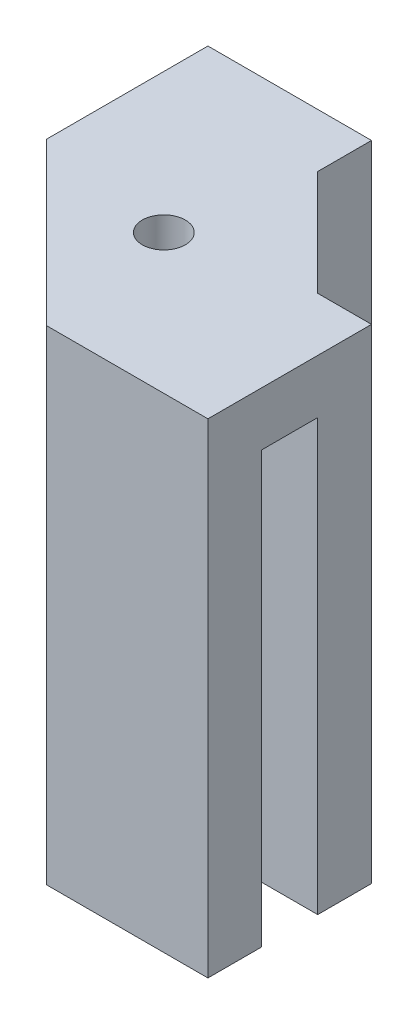
ISO-10303-21;
HEADER;
FILE_DESCRIPTION(('STEP AP214'),'2;1');
FILE_NAME('part.step','',(''),(''),'','','');
FILE_SCHEMA(('AUTOMOTIVE_DESIGN { 1 0 10303 214 1 1 1 1 }'));
ENDSEC;
DATA;
#1=APPLICATION_CONTEXT('core data for automotive mechanical design processes');
#2=APPLICATION_PROTOCOL_DEFINITION('international standard','automotive_design',2000,#1);
#3=PRODUCT_CONTEXT('',#1,'mechanical');
#4=PRODUCT('Part','Part','',(#3));
#5=PRODUCT_RELATED_PRODUCT_CATEGORY('part','',(#4));
#6=PRODUCT_DEFINITION_FORMATION('','',#4);
#7=PRODUCT_DEFINITION_CONTEXT('part definition',#1,'design');
#8=PRODUCT_DEFINITION('design','',#6,#7);
#9=PRODUCT_DEFINITION_SHAPE('','',#8);
#10=(LENGTH_UNIT() NAMED_UNIT(*) SI_UNIT(.MILLI.,.METRE.));
#11=(NAMED_UNIT(*) PLANE_ANGLE_UNIT() SI_UNIT($,.RADIAN.));
#12=(NAMED_UNIT(*) SI_UNIT($,.STERADIAN.) SOLID_ANGLE_UNIT());
#13=UNCERTAINTY_MEASURE_WITH_UNIT(LENGTH_MEASURE(1.E-05),#10,'distance_accuracy_value','');
#14=(GEOMETRIC_REPRESENTATION_CONTEXT(3) GLOBAL_UNCERTAINTY_ASSIGNED_CONTEXT((#13)) GLOBAL_UNIT_ASSIGNED_CONTEXT((#10,
#11,#12)) REPRESENTATION_CONTEXT('',''));
#15=CARTESIAN_POINT('',(0.,0.,0.));
#16=DIRECTION('',(0.,0.,1.));
#17=DIRECTION('',(1.,0.,0.));
#18=AXIS2_PLACEMENT_3D('',#15,#16,#17);
#19=CARTESIAN_POINT('',(9.652,50.8,-22.098));
#20=DIRECTION('',(-1.,0.,0.));
#21=DIRECTION('',(0.,0.,1.));
#22=AXIS2_PLACEMENT_3D('',#19,#20,#21);
#23=PLANE('',#22);
#24=DIRECTION('',(0.,0.,-1.));
#25=VECTOR('',#24,1.);
#26=CARTESIAN_POINT('',(9.652,0.,-22.098));
#27=LINE('',#26,#25);
#28=CARTESIAN_POINT('',(9.652,0.,-22.098));
#29=VERTEX_POINT('',#28);
#30=CARTESIAN_POINT('',(9.652,0.,-28.4479999999999));
#31=VERTEX_POINT('',#30);
#32=EDGE_CURVE('E178',#29,#31,#27,.T.);
#33=ORIENTED_EDGE('',*,*,#32,.T.);
#34=DIRECTION('',(0.,-1.,0.));
#35=VECTOR('',#34,1.);
#36=CARTESIAN_POINT('',(9.652,50.8,-28.4479999999999));
#37=LINE('',#36,#35);
#38=CARTESIAN_POINT('',(9.652,57.15,-28.4479999999999));
#39=VERTEX_POINT('',#38);
#40=EDGE_CURVE('E11',#39,#31,#37,.T.);
#41=ORIENTED_EDGE('',*,*,#40,.F.);
#42=DIRECTION('',(0.,0.,-1.));
#43=VECTOR('',#42,1.);
#44=CARTESIAN_POINT('',(9.652,57.15,-22.098));
#45=LINE('',#44,#43);
#46=CARTESIAN_POINT('',(9.652,57.15,-22.098));
#47=VERTEX_POINT('',#46);
#48=EDGE_CURVE('E169',#47,#39,#45,.T.);
#49=ORIENTED_EDGE('',*,*,#48,.F.);
#50=DIRECTION('',(0.,-1.,0.));
#51=VECTOR('',#50,1.);
#52=CARTESIAN_POINT('',(9.652,50.8,-22.098));
#53=LINE('',#52,#51);
#54=EDGE_CURVE('E190',#47,#29,#53,.T.);
#55=ORIENTED_EDGE('',*,*,#54,.T.);
#56=EDGE_LOOP('',(#33,#41,#49,#55));
#57=FACE_BOUND('',#56,.T.);
#58=ADVANCED_FACE('F39',(#57),#23,.F.);
#59=CARTESIAN_POINT('',(3.302,50.8,-28.4479999999999));
#60=DIRECTION('',(1.,0.,0.));
#61=DIRECTION('',(0.,0.,-1.));
#62=AXIS2_PLACEMENT_3D('',#59,#60,#61);
#63=PLANE('',#62);
#64=DIRECTION('',(0.,0.,1.));
#65=VECTOR('',#64,1.);
#66=CARTESIAN_POINT('',(3.302,0.,-28.4479999999999));
#67=LINE('',#66,#65);
#68=CARTESIAN_POINT('',(3.302,0.,-28.4479999999999));
#69=VERTEX_POINT('',#68);
#70=CARTESIAN_POINT('',(3.302,0.,-15.748));
#71=VERTEX_POINT('',#70);
#72=EDGE_CURVE('E195',#69,#71,#67,.T.);
#73=ORIENTED_EDGE('',*,*,#72,.T.);
#74=DIRECTION('',(0.,-1.,0.));
#75=VECTOR('',#74,1.);
#76=CARTESIAN_POINT('',(3.302,50.8,-15.748));
#77=LINE('',#76,#75);
#78=CARTESIAN_POINT('',(3.302,50.8,-15.748));
#79=VERTEX_POINT('',#78);
#80=EDGE_CURVE('E245',#79,#71,#77,.T.);
#81=ORIENTED_EDGE('',*,*,#80,.F.);
#82=DIRECTION('',(0.,0.,1.));
#83=VECTOR('',#82,1.);
#84=CARTESIAN_POINT('',(3.302,50.8,-28.4479999999999));
#85=LINE('',#84,#83);
#86=CARTESIAN_POINT('',(3.302,50.8,-28.4479999999999));
#87=VERTEX_POINT('',#86);
#88=EDGE_CURVE('E180',#87,#79,#85,.T.);
#89=ORIENTED_EDGE('',*,*,#88,.F.);
#90=DIRECTION('',(0.,-1.,0.));
#91=VECTOR('',#90,1.);
#92=CARTESIAN_POINT('',(3.302,50.8,-28.4479999999999));
#93=LINE('',#92,#91);
#94=EDGE_CURVE('E47',#87,#69,#93,.T.);
#95=ORIENTED_EDGE('',*,*,#94,.T.);
#96=EDGE_LOOP('',(#73,#81,#89,#95));
#97=FACE_BOUND('',#96,.T.);
#98=ADVANCED_FACE('F249',(#97),#63,.F.);
#99=CARTESIAN_POINT('',(3.302,50.8,-15.748));
#100=DIRECTION('',(0.,0.,1.));
#101=DIRECTION('',(1.,0.,0.));
#102=AXIS2_PLACEMENT_3D('',#99,#100,#101);
#103=PLANE('',#102);
#104=DIRECTION('',(-1.,0.,0.));
#105=VECTOR('',#104,1.);
#106=CARTESIAN_POINT('',(3.302,0.,-15.748));
#107=LINE('',#106,#105);
#108=CARTESIAN_POINT('',(-3.302,0.,-15.748));
#109=VERTEX_POINT('',#108);
#110=EDGE_CURVE('E197',#71,#109,#107,.T.);
#111=ORIENTED_EDGE('',*,*,#110,.T.);
#112=DIRECTION('',(0.,-1.,0.));
#113=VECTOR('',#112,1.);
#114=CARTESIAN_POINT('',(-3.302,50.8,-15.748));
#115=LINE('',#114,#113);
#116=CARTESIAN_POINT('',(-3.302,50.8,-15.748));
#117=VERTEX_POINT('',#116);
#118=EDGE_CURVE('E242',#117,#109,#115,.T.);
#119=ORIENTED_EDGE('',*,*,#118,.F.);
#120=DIRECTION('',(-1.,0.,0.));
#121=VECTOR('',#120,1.);
#122=CARTESIAN_POINT('',(3.302,50.8,-15.748));
#123=LINE('',#122,#121);
#124=EDGE_CURVE('E183',#79,#117,#123,.T.);
#125=ORIENTED_EDGE('',*,*,#124,.F.);
#126=ORIENTED_EDGE('',*,*,#80,.T.);
#127=EDGE_LOOP('',(#111,#119,#125,#126));
#128=FACE_BOUND('',#127,.T.);
#129=ADVANCED_FACE('F258',(#128),#103,.F.);
#130=CARTESIAN_POINT('',(-3.302,50.8,-28.4479999999999));
#131=DIRECTION('',(-1.,0.,0.));
#132=DIRECTION('',(0.,0.,1.));
#133=AXIS2_PLACEMENT_3D('',#130,#131,#132);
#134=PLANE('',#133);
#135=DIRECTION('',(0.,0.,-1.));
#136=VECTOR('',#135,1.);
#137=CARTESIAN_POINT('',(-3.302,0.,-28.4479999999999));
#138=LINE('',#137,#136);
#139=CARTESIAN_POINT('',(-3.302,0.,-28.4479999999999));
#140=VERTEX_POINT('',#139);
#141=EDGE_CURVE('E199',#109,#140,#138,.T.);
#142=ORIENTED_EDGE('',*,*,#141,.T.);
#143=DIRECTION('',(0.,-1.,0.));
#144=VECTOR('',#143,1.);
#145=CARTESIAN_POINT('',(-3.302,50.8,-28.4479999999999));
#146=LINE('',#145,#144);
#147=CARTESIAN_POINT('',(-3.302,50.8,-28.4479999999999));
#148=VERTEX_POINT('',#147);
#149=EDGE_CURVE('E239',#148,#140,#146,.T.);
#150=ORIENTED_EDGE('',*,*,#149,.F.);
#151=DIRECTION('',(0.,0.,-1.));
#152=VECTOR('',#151,1.);
#153=CARTESIAN_POINT('',(-3.302,50.8,-28.4479999999999));
#154=LINE('',#153,#152);
#155=EDGE_CURVE('E160',#117,#148,#154,.T.);
#156=ORIENTED_EDGE('',*,*,#155,.F.);
#157=ORIENTED_EDGE('',*,*,#118,.T.);
#158=EDGE_LOOP('',(#142,#150,#156,#157));
#159=FACE_BOUND('',#158,.T.);
#160=ADVANCED_FACE('F262',(#159),#134,.F.);
#161=CARTESIAN_POINT('',(-3.302,50.8,-28.4479999999999));
#162=DIRECTION('',(0.,0.,1.));
#163=DIRECTION('',(1.,0.,0.));
#164=AXIS2_PLACEMENT_3D('',#161,#162,#163);
#165=PLANE('',#164);
#166=DIRECTION('',(-1.,0.,0.));
#167=VECTOR('',#166,1.);
#168=CARTESIAN_POINT('',(-3.302,0.,-28.4479999999999));
#169=LINE('',#168,#167);
#170=CARTESIAN_POINT('',(-9.652,0.,-28.4479999999999));
#171=VERTEX_POINT('',#170);
#172=EDGE_CURVE('E201',#140,#171,#169,.T.);
#173=ORIENTED_EDGE('',*,*,#172,.T.);
#174=DIRECTION('',(0.,-1.,0.));
#175=VECTOR('',#174,1.);
#176=CARTESIAN_POINT('',(-9.652,50.8,-28.4479999999999));
#177=LINE('',#176,#175);
#178=CARTESIAN_POINT('',(-9.652,57.15,-28.4479999999999));
#179=VERTEX_POINT('',#178);
#180=EDGE_CURVE('E236',#179,#171,#177,.T.);
#181=ORIENTED_EDGE('',*,*,#180,.F.);
#182=DIRECTION('',(-1.,0.,0.));
#183=VECTOR('',#182,1.);
#184=CARTESIAN_POINT('',(9.652,57.15,-28.4479999999999));
#185=LINE('',#184,#183);
#186=EDGE_CURVE('E293',#39,#179,#185,.T.);
#187=ORIENTED_EDGE('',*,*,#186,.F.);
#188=ORIENTED_EDGE('',*,*,#40,.T.);
#189=DIRECTION('',(-1.,0.,0.));
#190=VECTOR('',#189,1.);
#191=CARTESIAN_POINT('',(9.652,0.,-28.4479999999999));
#192=LINE('',#191,#190);
#193=EDGE_CURVE('E193',#31,#69,#192,.T.);
#194=ORIENTED_EDGE('',*,*,#193,.T.);
#195=ORIENTED_EDGE('',*,*,#94,.F.);
#196=DIRECTION('',(-1.,0.,0.));
#197=VECTOR('',#196,1.);
#198=CARTESIAN_POINT('',(-3.302,50.8,-28.4479999999999));
#199=LINE('',#198,#197);
#200=EDGE_CURVE('E166',#87,#148,#199,.T.);
#201=ORIENTED_EDGE('',*,*,#200,.T.);
#202=ORIENTED_EDGE('',*,*,#149,.T.);
#203=EDGE_LOOP('',(#173,#181,#187,#188,#194,#195,#201,#202));
#204=FACE_BOUND('',#203,.T.);
#205=ADVANCED_FACE('F265',(#204),#165,.F.);
#206=CARTESIAN_POINT('',(-9.652,50.8,-28.4479999999999));
#207=DIRECTION('',(1.,0.,0.));
#208=DIRECTION('',(0.,0.,-1.));
#209=AXIS2_PLACEMENT_3D('',#206,#207,#208);
#210=PLANE('',#209);
#211=DIRECTION('',(0.,0.,1.));
#212=VECTOR('',#211,1.);
#213=CARTESIAN_POINT('',(-9.652,0.,-28.4479999999999));
#214=LINE('',#213,#212);
#215=CARTESIAN_POINT('',(-9.652,0.,-9.39799999999991));
#216=VERTEX_POINT('',#215);
#217=EDGE_CURVE('E203',#171,#216,#214,.T.);
#218=ORIENTED_EDGE('',*,*,#217,.T.);
#219=DIRECTION('',(0.,-1.,0.));
#220=VECTOR('',#219,1.);
#221=CARTESIAN_POINT('',(-9.652,50.8,-9.39799999999991));
#222=LINE('',#221,#220);
#223=CARTESIAN_POINT('',(-9.652,57.15,-9.39799999999991));
#224=VERTEX_POINT('',#223);
#225=EDGE_CURVE('E233',#224,#216,#222,.T.);
#226=ORIENTED_EDGE('',*,*,#225,.F.);
#227=DIRECTION('',(0.,0.,1.));
#228=VECTOR('',#227,1.);
#229=CARTESIAN_POINT('',(-9.652,57.15,-28.4479999999999));
#230=LINE('',#229,#228);
#231=EDGE_CURVE('E289',#179,#224,#230,.T.);
#232=ORIENTED_EDGE('',*,*,#231,.F.);
#233=ORIENTED_EDGE('',*,*,#180,.T.);
#234=EDGE_LOOP('',(#218,#226,#232,#233));
#235=FACE_BOUND('',#234,.T.);
#236=ADVANCED_FACE('F272',(#235),#210,.F.);
#237=CARTESIAN_POINT('',(-9.652,50.8,-9.39799999999991));
#238=DIRECTION('',(0.707106781186549,0.,-0.707106781186546));
#239=DIRECTION('',(-0.707106781186546,0.,-0.707106781186549));
#240=AXIS2_PLACEMENT_3D('',#237,#238,#239);
#241=PLANE('',#240);
#242=DIRECTION('',(0.707106781186546,0.,0.707106781186549));
#243=VECTOR('',#242,1.);
#244=CARTESIAN_POINT('',(-9.652,0.,-9.39799999999991));
#245=LINE('',#244,#243);
#246=CARTESIAN_POINT('',(9.39799999999988,0.,9.65200000000003));
#247=VERTEX_POINT('',#246);
#248=EDGE_CURVE('E205',#216,#247,#245,.T.);
#249=ORIENTED_EDGE('',*,*,#248,.T.);
#250=DIRECTION('',(0.,-1.,0.));
#251=VECTOR('',#250,1.);
#252=CARTESIAN_POINT('',(9.39799999999988,50.8,9.65200000000003));
#253=LINE('',#252,#251);
#254=CARTESIAN_POINT('',(9.39799999999988,57.15,9.65200000000003));
#255=VERTEX_POINT('',#254);
#256=EDGE_CURVE('E230',#255,#247,#253,.T.);
#257=ORIENTED_EDGE('',*,*,#256,.F.);
#258=DIRECTION('',(0.707106781186546,0.,0.707106781186549));
#259=VECTOR('',#258,1.);
#260=CARTESIAN_POINT('',(-9.652,57.15,-9.39799999999991));
#261=LINE('',#260,#259);
#262=EDGE_CURVE('E281',#224,#255,#261,.T.);
#263=ORIENTED_EDGE('',*,*,#262,.F.);
#264=ORIENTED_EDGE('',*,*,#225,.T.);
#265=EDGE_LOOP('',(#249,#257,#263,#264));
#266=FACE_BOUND('',#265,.T.);
#267=ADVANCED_FACE('F278',(#266),#241,.F.);
#268=CARTESIAN_POINT('',(28.4479999999999,50.8,9.65200000000009));
#269=DIRECTION('',(0.,0.,-1.));
#270=DIRECTION('',(-1.,0.,0.));
#271=AXIS2_PLACEMENT_3D('',#268,#269,#270);
#272=PLANE('',#271);
#273=DIRECTION('',(1.,0.,0.));
#274=VECTOR('',#273,1.);
#275=CARTESIAN_POINT('',(28.4479999999999,0.,9.65200000000009));
#276=LINE('',#275,#274);
#277=CARTESIAN_POINT('',(28.4479999999999,0.,9.65200000000009));
#278=VERTEX_POINT('',#277);
#279=EDGE_CURVE('E207',#247,#278,#276,.T.);
#280=ORIENTED_EDGE('',*,*,#279,.T.);
#281=DIRECTION('',(0.,-1.,0.));
#282=VECTOR('',#281,1.);
#283=CARTESIAN_POINT('',(28.4479999999999,50.8,9.65200000000009));
#284=LINE('',#283,#282);
#285=CARTESIAN_POINT('',(28.4479999999999,57.15,9.65200000000009));
#286=VERTEX_POINT('',#285);
#287=EDGE_CURVE('E150',#286,#278,#284,.T.);
#288=ORIENTED_EDGE('',*,*,#287,.F.);
#289=DIRECTION('',(1.,0.,0.));
#290=VECTOR('',#289,1.);
#291=CARTESIAN_POINT('',(9.39799999999988,57.15,9.65200000000003));
#292=LINE('',#291,#290);
#293=EDGE_CURVE('E288',#255,#286,#292,.T.);
#294=ORIENTED_EDGE('',*,*,#293,.F.);
#295=ORIENTED_EDGE('',*,*,#256,.T.);
#296=EDGE_LOOP('',(#280,#288,#294,#295));
#297=FACE_BOUND('',#296,.T.);
#298=ADVANCED_FACE('F347',(#297),#272,.F.);
#299=CARTESIAN_POINT('',(28.4479999999999,50.8,3.3020000000001));
#300=DIRECTION('',(0.,0.,1.));
#301=DIRECTION('',(1.,0.,0.));
#302=AXIS2_PLACEMENT_3D('',#299,#300,#301);
#303=PLANE('',#302);
#304=DIRECTION('',(-1.,0.,0.));
#305=VECTOR('',#304,1.);
#306=CARTESIAN_POINT('',(28.4479999999999,0.,3.3020000000001));
#307=LINE('',#306,#305);
#308=CARTESIAN_POINT('',(28.4479999999999,0.,3.3020000000001));
#309=VERTEX_POINT('',#308);
#310=CARTESIAN_POINT('',(15.748,0.,3.30200000000006));
#311=VERTEX_POINT('',#310);
#312=EDGE_CURVE('E210',#309,#311,#307,.T.);
#313=ORIENTED_EDGE('',*,*,#312,.T.);
#314=DIRECTION('',(0.,-1.,0.));
#315=VECTOR('',#314,1.);
#316=CARTESIAN_POINT('',(15.748,50.8,3.30200000000006));
#317=LINE('',#316,#315);
#318=CARTESIAN_POINT('',(15.748,50.8,3.30200000000006));
#319=VERTEX_POINT('',#318);
#320=EDGE_CURVE('E151',#319,#311,#317,.T.);
#321=ORIENTED_EDGE('',*,*,#320,.F.);
#322=DIRECTION('',(-1.,0.,0.));
#323=VECTOR('',#322,1.);
#324=CARTESIAN_POINT('',(28.4479999999999,50.8,3.3020000000001));
#325=LINE('',#324,#323);
#326=CARTESIAN_POINT('',(28.4479999999999,50.8,3.3020000000001));
#327=VERTEX_POINT('',#326);
#328=EDGE_CURVE('E154',#327,#319,#325,.T.);
#329=ORIENTED_EDGE('',*,*,#328,.F.);
#330=DIRECTION('',(0.,-1.,0.));
#331=VECTOR('',#330,1.);
#332=CARTESIAN_POINT('',(28.4479999999999,50.8,3.3020000000001));
#333=LINE('',#332,#331);
#334=EDGE_CURVE('E139',#327,#309,#333,.T.);
#335=ORIENTED_EDGE('',*,*,#334,.T.);
#336=EDGE_LOOP('',(#313,#321,#329,#335));
#337=FACE_BOUND('',#336,.T.);
#338=ADVANCED_FACE('F155',(#337),#303,.F.);
#339=CARTESIAN_POINT('',(15.748,50.8,-3.30199999999994));
#340=DIRECTION('',(-1.,0.,0.));
#341=DIRECTION('',(0.,0.,1.));
#342=AXIS2_PLACEMENT_3D('',#339,#340,#341);
#343=PLANE('',#342);
#344=DIRECTION('',(0.,0.,-1.));
#345=VECTOR('',#344,1.);
#346=CARTESIAN_POINT('',(15.748,0.,-3.30199999999994));
#347=LINE('',#346,#345);
#348=CARTESIAN_POINT('',(15.748,0.,-3.30199999999994));
#349=VERTEX_POINT('',#348);
#350=EDGE_CURVE('E212',#311,#349,#347,.T.);
#351=ORIENTED_EDGE('',*,*,#350,.T.);
#352=DIRECTION('',(0.,-1.,0.));
#353=VECTOR('',#352,1.);
#354=CARTESIAN_POINT('',(15.748,50.8,-3.30199999999994));
#355=LINE('',#354,#353);
#356=CARTESIAN_POINT('',(15.748,50.8,-3.30199999999994));
#357=VERTEX_POINT('',#356);
#358=EDGE_CURVE('E55',#357,#349,#355,.T.);
#359=ORIENTED_EDGE('',*,*,#358,.F.);
#360=DIRECTION('',(0.,0.,-1.));
#361=VECTOR('',#360,1.);
#362=CARTESIAN_POINT('',(15.748,50.8,-3.30199999999994));
#363=LINE('',#362,#361);
#364=EDGE_CURVE('E159',#319,#357,#363,.T.);
#365=ORIENTED_EDGE('',*,*,#364,.F.);
#366=ORIENTED_EDGE('',*,*,#320,.T.);
#367=EDGE_LOOP('',(#351,#359,#365,#366));
#368=FACE_BOUND('',#367,.T.);
#369=ADVANCED_FACE('F353',(#368),#343,.F.);
#370=CARTESIAN_POINT('',(28.4479999999999,50.8,-3.3019999999999));
#371=DIRECTION('',(0.,0.,-1.));
#372=DIRECTION('',(-1.,0.,0.));
#373=AXIS2_PLACEMENT_3D('',#370,#371,#372);
#374=PLANE('',#373);
#375=DIRECTION('',(1.,0.,0.));
#376=VECTOR('',#375,1.);
#377=CARTESIAN_POINT('',(28.4479999999999,0.,-3.3019999999999));
#378=LINE('',#377,#376);
#379=CARTESIAN_POINT('',(28.4479999999999,0.,-3.3019999999999));
#380=VERTEX_POINT('',#379);
#381=EDGE_CURVE('E214',#349,#380,#378,.T.);
#382=ORIENTED_EDGE('',*,*,#381,.T.);
#383=DIRECTION('',(0.,-1.,0.));
#384=VECTOR('',#383,1.);
#385=CARTESIAN_POINT('',(28.4479999999999,50.8,-3.3019999999999));
#386=LINE('',#385,#384);
#387=CARTESIAN_POINT('',(28.4479999999999,50.8,-3.30199999999992));
#388=VERTEX_POINT('',#387);
#389=EDGE_CURVE('E225',#388,#380,#386,.T.);
#390=ORIENTED_EDGE('',*,*,#389,.F.);
#391=DIRECTION('',(1.,0.,0.));
#392=VECTOR('',#391,1.);
#393=CARTESIAN_POINT('',(28.4479999999999,50.8,-3.3019999999999));
#394=LINE('',#393,#392);
#395=EDGE_CURVE('E164',#357,#388,#394,.T.);
#396=ORIENTED_EDGE('',*,*,#395,.F.);
#397=ORIENTED_EDGE('',*,*,#358,.T.);
#398=EDGE_LOOP('',(#382,#390,#396,#397));
#399=FACE_BOUND('',#398,.T.);
#400=ADVANCED_FACE('F356',(#399),#374,.F.);
#401=CARTESIAN_POINT('',(28.4479999999999,50.8,-9.65199999999991));
#402=DIRECTION('',(-1.,0.,0.));
#403=DIRECTION('',(0.,0.,1.));
#404=AXIS2_PLACEMENT_3D('',#401,#402,#403);
#405=PLANE('',#404);
#406=DIRECTION('',(0.,0.,-1.));
#407=VECTOR('',#406,1.);
#408=CARTESIAN_POINT('',(28.4479999999999,0.,-9.65199999999991));
#409=LINE('',#408,#407);
#410=CARTESIAN_POINT('',(28.4479999999999,0.,-9.65199999999991));
#411=VERTEX_POINT('',#410);
#412=EDGE_CURVE('E216',#380,#411,#409,.T.);
#413=ORIENTED_EDGE('',*,*,#412,.T.);
#414=DIRECTION('',(0.,-1.,0.));
#415=VECTOR('',#414,1.);
#416=CARTESIAN_POINT('',(28.4479999999999,50.8,-9.65199999999991));
#417=LINE('',#416,#415);
#418=CARTESIAN_POINT('',(28.4479999999999,57.15,-9.65199999999991));
#419=VERTEX_POINT('',#418);
#420=EDGE_CURVE('E223',#419,#411,#417,.T.);
#421=ORIENTED_EDGE('',*,*,#420,.F.);
#422=DIRECTION('',(0.,0.,-1.));
#423=VECTOR('',#422,1.);
#424=CARTESIAN_POINT('',(28.4479999999999,57.15,9.65200000000009));
#425=LINE('',#424,#423);
#426=EDGE_CURVE('E291',#286,#419,#425,.T.);
#427=ORIENTED_EDGE('',*,*,#426,.F.);
#428=ORIENTED_EDGE('',*,*,#287,.T.);
#429=DIRECTION('',(0.,0.,-1.));
#430=VECTOR('',#429,1.);
#431=CARTESIAN_POINT('',(28.4479999999999,0.,3.3020000000001));
#432=LINE('',#431,#430);
#433=EDGE_CURVE('E147',#278,#309,#432,.T.);
#434=ORIENTED_EDGE('',*,*,#433,.T.);
#435=ORIENTED_EDGE('',*,*,#334,.F.);
#436=DIRECTION('',(0.,0.,-1.));
#437=VECTOR('',#436,1.);
#438=CARTESIAN_POINT('',(28.4479999999999,50.8,-3.3019999999999));
#439=LINE('',#438,#437);
#440=EDGE_CURVE('E144',#327,#388,#439,.T.);
#441=ORIENTED_EDGE('',*,*,#440,.T.);
#442=ORIENTED_EDGE('',*,*,#389,.T.);
#443=EDGE_LOOP('',(#413,#421,#427,#428,#434,#435,#441,#442));
#444=FACE_BOUND('',#443,.T.);
#445=ADVANCED_FACE('F141',(#444),#405,.F.);
#446=CARTESIAN_POINT('',(22.0980000000001,50.8,-9.65199999999993));
#447=DIRECTION('',(0.,0.,1.));
#448=DIRECTION('',(1.,0.,0.));
#449=AXIS2_PLACEMENT_3D('',#446,#447,#448);
#450=PLANE('',#449);
#451=DIRECTION('',(-1.,0.,0.));
#452=VECTOR('',#451,1.);
#453=CARTESIAN_POINT('',(22.0980000000001,0.,-9.65199999999993));
#454=LINE('',#453,#452);
#455=CARTESIAN_POINT('',(22.0980000000001,0.,-9.65199999999993));
#456=VERTEX_POINT('',#455);
#457=EDGE_CURVE('E109',#411,#456,#454,.T.);
#458=ORIENTED_EDGE('',*,*,#457,.T.);
#459=DIRECTION('',(0.,-1.,0.));
#460=VECTOR('',#459,1.);
#461=CARTESIAN_POINT('',(22.0980000000001,50.8,-9.65199999999993));
#462=LINE('',#461,#460);
#463=CARTESIAN_POINT('',(22.0980000000001,57.15,-9.65199999999993));
#464=VERTEX_POINT('',#463);
#465=EDGE_CURVE('E221',#464,#456,#462,.T.);
#466=ORIENTED_EDGE('',*,*,#465,.F.);
#467=DIRECTION('',(-1.,0.,0.));
#468=VECTOR('',#467,1.);
#469=CARTESIAN_POINT('',(28.4479999999999,57.15,-9.65199999999991));
#470=LINE('',#469,#468);
#471=EDGE_CURVE('E179',#419,#464,#470,.T.);
#472=ORIENTED_EDGE('',*,*,#471,.F.);
#473=ORIENTED_EDGE('',*,*,#420,.T.);
#474=EDGE_LOOP('',(#458,#466,#472,#473));
#475=FACE_BOUND('',#474,.T.);
#476=ADVANCED_FACE('F362',(#475),#450,.F.);
#477=CARTESIAN_POINT('',(22.0980000000001,50.8,-9.65199999999993));
#478=DIRECTION('',(-0.707106781186549,0.,0.707106781186546));
#479=DIRECTION('',(0.707106781186546,0.,0.707106781186549));
#480=AXIS2_PLACEMENT_3D('',#477,#478,#479);
#481=PLANE('',#480);
#482=DIRECTION('',(-0.707106781186546,0.,-0.707106781186549));
#483=VECTOR('',#482,1.);
#484=CARTESIAN_POINT('',(22.0980000000001,0.,-9.65199999999993));
#485=LINE('',#484,#483);
#486=EDGE_CURVE('E116',#456,#29,#485,.T.);
#487=ORIENTED_EDGE('',*,*,#486,.T.);
#488=ORIENTED_EDGE('',*,*,#54,.F.);
#489=DIRECTION('',(-0.707106781186546,0.,-0.707106781186549));
#490=VECTOR('',#489,1.);
#491=CARTESIAN_POINT('',(22.0980000000001,57.15,-9.65199999999993));
#492=LINE('',#491,#490);
#493=EDGE_CURVE('E165',#464,#47,#492,.T.);
#494=ORIENTED_EDGE('',*,*,#493,.F.);
#495=ORIENTED_EDGE('',*,*,#465,.T.);
#496=EDGE_LOOP('',(#487,#488,#494,#495));
#497=FACE_BOUND('',#496,.T.);
#498=ADVANCED_FACE('F308',(#497),#481,.F.);
#499=CARTESIAN_POINT('',(0.,0.,0.));
#500=DIRECTION('',(0.,1.,0.));
#501=DIRECTION('',(0.,0.,1.));
#502=AXIS2_PLACEMENT_3D('',#499,#500,#501);
#503=PLANE('',#502);
#504=CARTESIAN_POINT('',(6.79534666666667,0.,-6.79534666666665));
#505=DIRECTION('',(0.,1.,0.));
#506=DIRECTION('',(0.,0.,1.));
#507=AXIS2_PLACEMENT_3D('',#504,#505,#506);
#508=CIRCLE('',#507,2.53999999999999);
#509=CARTESIAN_POINT('',(6.79534666666667,0.,-4.25534666666666));
#510=VERTEX_POINT('',#509);
#511=EDGE_CURVE('E175',#510,#510,#508,.T.);
#512=ORIENTED_EDGE('',*,*,#511,.T.);
#513=EDGE_LOOP('',(#512));
#514=FACE_BOUND('',#513,.T.);
#515=ORIENTED_EDGE('',*,*,#32,.F.);
#516=ORIENTED_EDGE('',*,*,#486,.F.);
#517=ORIENTED_EDGE('',*,*,#457,.F.);
#518=ORIENTED_EDGE('',*,*,#412,.F.);
#519=ORIENTED_EDGE('',*,*,#381,.F.);
#520=ORIENTED_EDGE('',*,*,#350,.F.);
#521=ORIENTED_EDGE('',*,*,#312,.F.);
#522=ORIENTED_EDGE('',*,*,#433,.F.);
#523=ORIENTED_EDGE('',*,*,#279,.F.);
#524=ORIENTED_EDGE('',*,*,#248,.F.);
#525=ORIENTED_EDGE('',*,*,#217,.F.);
#526=ORIENTED_EDGE('',*,*,#172,.F.);
#527=ORIENTED_EDGE('',*,*,#141,.F.);
#528=ORIENTED_EDGE('',*,*,#110,.F.);
#529=ORIENTED_EDGE('',*,*,#72,.F.);
#530=ORIENTED_EDGE('',*,*,#193,.F.);
#531=EDGE_LOOP('',(#515,#516,#517,#518,#519,#520,#521,#522,#523,#524,#525,#526,#527,#528,#529,#530));
#532=FACE_BOUND('',#531,.T.);
#533=ADVANCED_FACE('F254',(#514,#532),#503,.F.);
#534=CARTESIAN_POINT('',(6.79534666666667,50.8,-6.79534666666665));
#535=DIRECTION('',(0.,1.,0.));
#536=DIRECTION('',(0.,0.,1.));
#537=AXIS2_PLACEMENT_3D('',#534,#535,#536);
#538=CYLINDRICAL_SURFACE('',#537,2.53999999999999);
#539=ORIENTED_EDGE('',*,*,#511,.F.);
#540=EDGE_LOOP('',(#539));
#541=FACE_BOUND('',#540,.T.);
#542=CARTESIAN_POINT('',(6.79534666666667,57.15,-6.79534666666665));
#543=DIRECTION('',(0.,1.,0.));
#544=DIRECTION('',(0.,0.,1.));
#545=AXIS2_PLACEMENT_3D('',#542,#543,#544);
#546=CIRCLE('',#545,2.53999999999999);
#547=CARTESIAN_POINT('',(6.79534666666667,57.15,-4.25534666666665));
#548=VERTEX_POINT('',#547);
#549=EDGE_CURVE('E171',#548,#548,#546,.T.);
#550=ORIENTED_EDGE('',*,*,#549,.T.);
#551=EDGE_LOOP('',(#550));
#552=FACE_BOUND('',#551,.T.);
#553=ADVANCED_FACE('F321',(#541,#552),#538,.F.);
#554=CARTESIAN_POINT('',(0.,50.8,0.));
#555=DIRECTION('',(0.,-1.,0.));
#556=DIRECTION('',(0.,0.,-1.));
#557=AXIS2_PLACEMENT_3D('',#554,#555,#556);
#558=PLANE('',#557);
#559=ORIENTED_EDGE('',*,*,#200,.F.);
#560=ORIENTED_EDGE('',*,*,#88,.T.);
#561=ORIENTED_EDGE('',*,*,#124,.T.);
#562=ORIENTED_EDGE('',*,*,#155,.T.);
#563=EDGE_LOOP('',(#559,#560,#561,#562));
#564=FACE_BOUND('',#563,.T.);
#565=ADVANCED_FACE('F264',(#564),#558,.T.);
#566=CARTESIAN_POINT('',(0.,57.15,0.));
#567=DIRECTION('',(0.,-1.,0.));
#568=DIRECTION('',(0.,0.,-1.));
#569=AXIS2_PLACEMENT_3D('',#566,#567,#568);
#570=PLANE('',#569);
#571=ORIENTED_EDGE('',*,*,#493,.T.);
#572=ORIENTED_EDGE('',*,*,#48,.T.);
#573=ORIENTED_EDGE('',*,*,#186,.T.);
#574=ORIENTED_EDGE('',*,*,#231,.T.);
#575=ORIENTED_EDGE('',*,*,#262,.T.);
#576=ORIENTED_EDGE('',*,*,#293,.T.);
#577=ORIENTED_EDGE('',*,*,#426,.T.);
#578=ORIENTED_EDGE('',*,*,#471,.T.);
#579=EDGE_LOOP('',(#571,#572,#573,#574,#575,#576,#577,#578));
#580=FACE_BOUND('',#579,.T.);
#581=ORIENTED_EDGE('',*,*,#549,.F.);
#582=EDGE_LOOP('',(#581));
#583=FACE_BOUND('',#582,.T.);
#584=ADVANCED_FACE('F302',(#580,#583),#570,.F.);
#585=ORIENTED_EDGE('',*,*,#440,.F.);
#586=ORIENTED_EDGE('',*,*,#328,.T.);
#587=ORIENTED_EDGE('',*,*,#364,.T.);
#588=ORIENTED_EDGE('',*,*,#395,.T.);
#589=EDGE_LOOP('',(#585,#586,#587,#588));
#590=FACE_BOUND('',#589,.T.);
#591=ADVANCED_FACE('F163',(#590),#558,.T.);
#592=CLOSED_SHELL('',(#58,#98,#129,#160,#205,#236,#267,#298,#338,#369,#400,#445,#476,#498,#533,
#553,#565,#584,#591));
#593=MANIFOLD_SOLID_BREP('B2',#592);
#594=ADVANCED_BREP_SHAPE_REPRESENTATION('',(#18,#593),#14);
#595=SHAPE_DEFINITION_REPRESENTATION(#9,#594);
ENDSEC;
END-ISO-10303-21;
